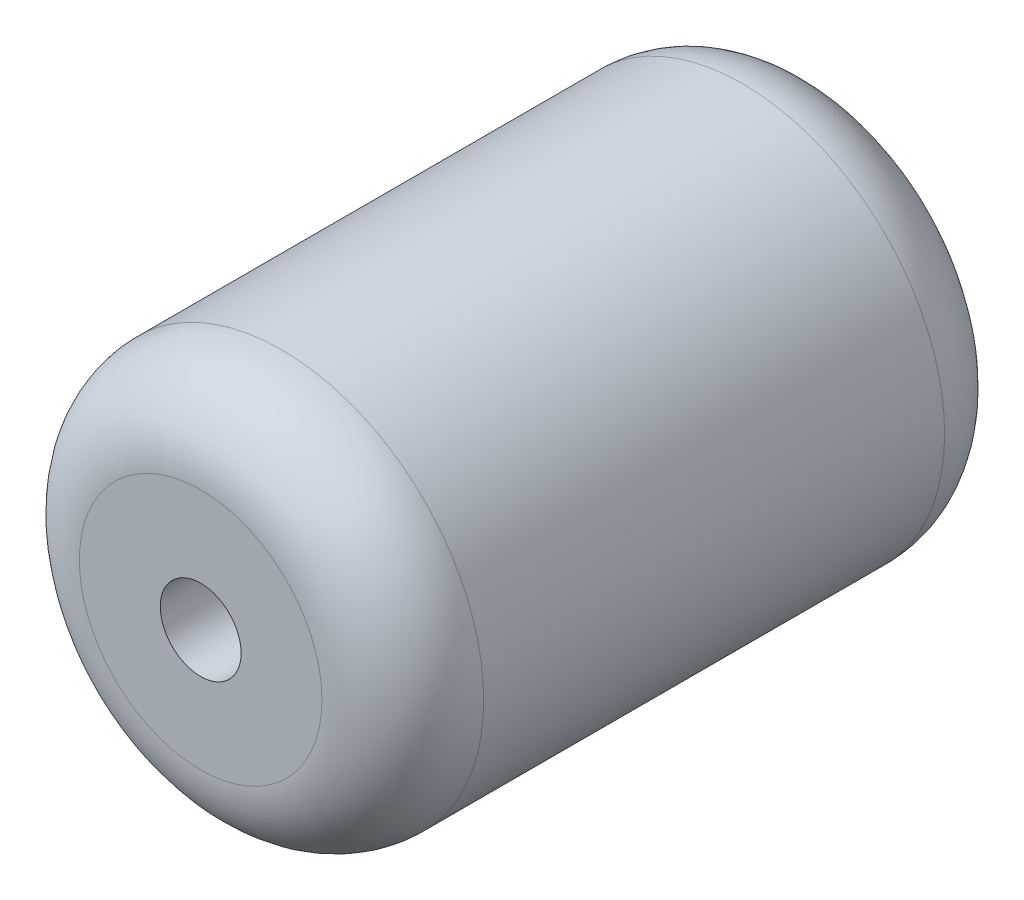
ISO-10303-21;
HEADER;
FILE_DESCRIPTION(('STEP AP214'),'2;1');
FILE_NAME('part.step','',(''),(''),'','','');
FILE_SCHEMA(('AUTOMOTIVE_DESIGN { 1 0 10303 214 1 1 1 1 }'));
ENDSEC;
DATA;
#1=APPLICATION_CONTEXT('core data for automotive mechanical design processes');
#2=APPLICATION_PROTOCOL_DEFINITION('international standard','automotive_design',2000,#1);
#3=PRODUCT_CONTEXT('',#1,'mechanical');
#4=PRODUCT('Part','Part','',(#3));
#5=PRODUCT_RELATED_PRODUCT_CATEGORY('part','',(#4));
#6=PRODUCT_DEFINITION_FORMATION('','',#4);
#7=PRODUCT_DEFINITION_CONTEXT('part definition',#1,'design');
#8=PRODUCT_DEFINITION('design','',#6,#7);
#9=PRODUCT_DEFINITION_SHAPE('','',#8);
#10=(LENGTH_UNIT() NAMED_UNIT(*) SI_UNIT(.MILLI.,.METRE.));
#11=(NAMED_UNIT(*) PLANE_ANGLE_UNIT() SI_UNIT($,.RADIAN.));
#12=(NAMED_UNIT(*) SI_UNIT($,.STERADIAN.) SOLID_ANGLE_UNIT());
#13=UNCERTAINTY_MEASURE_WITH_UNIT(LENGTH_MEASURE(1.E-05),#10,'distance_accuracy_value','');
#14=(GEOMETRIC_REPRESENTATION_CONTEXT(3) GLOBAL_UNCERTAINTY_ASSIGNED_CONTEXT((#13)) GLOBAL_UNIT_ASSIGNED_CONTEXT((#10,
#11,#12)) REPRESENTATION_CONTEXT('',''));
#15=CARTESIAN_POINT('',(0.,0.,0.));
#16=DIRECTION('',(0.,0.,1.));
#17=DIRECTION('',(1.,0.,0.));
#18=AXIS2_PLACEMENT_3D('',#15,#16,#17);
#19=CARTESIAN_POINT('',(0.,0.,77.));
#20=DIRECTION('',(0.,0.,1.));
#21=DIRECTION('',(1.,0.,0.));
#22=AXIS2_PLACEMENT_3D('',#19,#20,#21);
#23=PLANE('',#22);
#24=CARTESIAN_POINT('',(0.,0.,77.));
#25=DIRECTION('',(0.,0.,1.));
#26=DIRECTION('',(1.,0.,0.));
#27=AXIS2_PLACEMENT_3D('',#24,#25,#26);
#28=CIRCLE('',#27,15.);
#29=CARTESIAN_POINT('',(15.,0.,77.));
#30=VERTEX_POINT('',#29);
#31=EDGE_CURVE('E61',#30,#30,#28,.T.);
#32=ORIENTED_EDGE('',*,*,#31,.T.);
#33=EDGE_LOOP('',(#32));
#34=FACE_BOUND('',#33,.T.);
#35=CARTESIAN_POINT('',(0.,0.,77.));
#36=DIRECTION('',(0.,0.,1.));
#37=DIRECTION('',(1.,0.,0.));
#38=AXIS2_PLACEMENT_3D('',#35,#36,#37);
#39=CIRCLE('',#38,5.);
#40=CARTESIAN_POINT('',(5.,0.,77.));
#41=VERTEX_POINT('',#40);
#42=EDGE_CURVE('E67',#41,#41,#39,.T.);
#43=ORIENTED_EDGE('',*,*,#42,.F.);
#44=EDGE_LOOP('',(#43));
#45=FACE_BOUND('',#44,.T.);
#46=ADVANCED_FACE('F43',(#34,#45),#23,.T.);
#47=CARTESIAN_POINT('',(0.,0.,0.));
#48=DIRECTION('',(0.,0.,1.));
#49=DIRECTION('',(1.,0.,0.));
#50=AXIS2_PLACEMENT_3D('',#47,#48,#49);
#51=PLANE('',#50);
#52=CARTESIAN_POINT('',(0.,0.,0.));
#53=DIRECTION('',(0.,0.,1.));
#54=DIRECTION('',(1.,0.,0.));
#55=AXIS2_PLACEMENT_3D('',#52,#53,#54);
#56=CIRCLE('',#55,15.);
#57=CARTESIAN_POINT('',(15.,0.,0.));
#58=VERTEX_POINT('',#57);
#59=EDGE_CURVE('E10',#58,#58,#56,.F.);
#60=ORIENTED_EDGE('',*,*,#59,.T.);
#61=EDGE_LOOP('',(#60));
#62=FACE_BOUND('',#61,.T.);
#63=CARTESIAN_POINT('',(0.,0.,0.));
#64=DIRECTION('',(0.,0.,1.));
#65=DIRECTION('',(1.,0.,0.));
#66=AXIS2_PLACEMENT_3D('',#63,#64,#65);
#67=CIRCLE('',#66,5.);
#68=CARTESIAN_POINT('',(5.,0.,0.));
#69=VERTEX_POINT('',#68);
#70=EDGE_CURVE('E68',#69,#69,#67,.T.);
#71=ORIENTED_EDGE('',*,*,#70,.T.);
#72=EDGE_LOOP('',(#71));
#73=FACE_BOUND('',#72,.T.);
#74=ADVANCED_FACE('F80',(#62,#73),#51,.F.);
#75=CARTESIAN_POINT('',(0.,0.,77.));
#76=DIRECTION('',(0.,0.,-1.));
#77=DIRECTION('',(-1.,0.,0.));
#78=AXIS2_PLACEMENT_3D('',#75,#76,#77);
#79=CYLINDRICAL_SURFACE('',#78,25.);
#80=CARTESIAN_POINT('',(0.,0.,67.));
#81=DIRECTION('',(0.,0.,1.));
#82=DIRECTION('',(1.,0.,0.));
#83=AXIS2_PLACEMENT_3D('',#80,#81,#82);
#84=CIRCLE('',#83,25.);
#85=CARTESIAN_POINT('',(25.,0.,67.));
#86=VERTEX_POINT('',#85);
#87=EDGE_CURVE('E51',#86,#86,#84,.F.);
#88=ORIENTED_EDGE('',*,*,#87,.T.);
#89=EDGE_LOOP('',(#88));
#90=FACE_BOUND('',#89,.T.);
#91=CARTESIAN_POINT('',(0.,0.,9.99999999999999));
#92=DIRECTION('',(0.,0.,1.));
#93=DIRECTION('',(1.,0.,0.));
#94=AXIS2_PLACEMENT_3D('',#91,#92,#93);
#95=CIRCLE('',#94,25.);
#96=CARTESIAN_POINT('',(25.,0.,9.99999999999999));
#97=VERTEX_POINT('',#96);
#98=EDGE_CURVE('E56',#97,#97,#95,.T.);
#99=ORIENTED_EDGE('',*,*,#98,.T.);
#100=EDGE_LOOP('',(#99));
#101=FACE_BOUND('',#100,.T.);
#102=ADVANCED_FACE('F87',(#90,#101),#79,.T.);
#103=CARTESIAN_POINT('',(0.,0.,77.));
#104=DIRECTION('',(0.,0.,-1.));
#105=DIRECTION('',(-1.,0.,0.));
#106=AXIS2_PLACEMENT_3D('',#103,#104,#105);
#107=CYLINDRICAL_SURFACE('',#106,5.);
#108=ORIENTED_EDGE('',*,*,#42,.T.);
#109=EDGE_LOOP('',(#108));
#110=FACE_BOUND('',#109,.T.);
#111=ORIENTED_EDGE('',*,*,#70,.F.);
#112=EDGE_LOOP('',(#111));
#113=FACE_BOUND('',#112,.T.);
#114=ADVANCED_FACE('F76',(#110,#113),#107,.F.);
#115=CARTESIAN_POINT('',(0.,0.,67.));
#116=DIRECTION('',(0.,0.,1.));
#117=DIRECTION('',(1.,0.,0.));
#118=AXIS2_PLACEMENT_3D('',#115,#116,#117);
#119=TOROIDAL_SURFACE('',#118,15.,10.);
#120=ORIENTED_EDGE('',*,*,#87,.F.);
#121=EDGE_LOOP('',(#120));
#122=FACE_BOUND('',#121,.T.);
#123=ORIENTED_EDGE('',*,*,#31,.F.);
#124=EDGE_LOOP('',(#123));
#125=FACE_BOUND('',#124,.T.);
#126=ADVANCED_FACE('F92',(#122,#125),#119,.T.);
#127=CARTESIAN_POINT('',(0.,0.,9.99999999999999));
#128=DIRECTION('',(0.,0.,1.));
#129=DIRECTION('',(1.,0.,0.));
#130=AXIS2_PLACEMENT_3D('',#127,#128,#129);
#131=TOROIDAL_SURFACE('',#130,15.,10.);
#132=ORIENTED_EDGE('',*,*,#59,.F.);
#133=EDGE_LOOP('',(#132));
#134=FACE_BOUND('',#133,.T.);
#135=ORIENTED_EDGE('',*,*,#98,.F.);
#136=EDGE_LOOP('',(#135));
#137=FACE_BOUND('',#136,.T.);
#138=ADVANCED_FACE('F45',(#134,#137),#131,.T.);
#139=CLOSED_SHELL('',(#46,#74,#102,#114,#126,#138));
#140=MANIFOLD_SOLID_BREP('B2',#139);
#141=ADVANCED_BREP_SHAPE_REPRESENTATION('',(#18,#140),#14);
#142=SHAPE_DEFINITION_REPRESENTATION(#9,#141);
ENDSEC;
END-ISO-10303-21;
